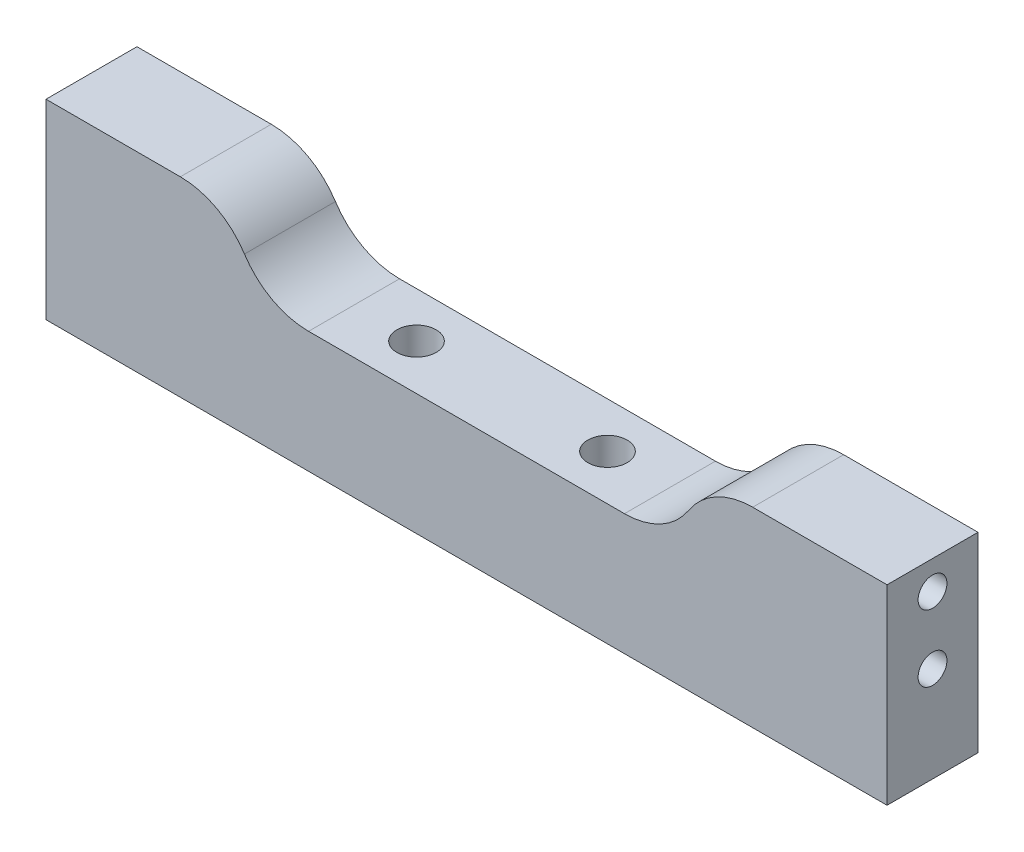
ISO-10303-21;
HEADER;
FILE_DESCRIPTION(('STEP AP214'),'2;1');
FILE_NAME('part.step','',(''),(''),'','','');
FILE_SCHEMA(('AUTOMOTIVE_DESIGN { 1 0 10303 214 1 1 1 1 }'));
ENDSEC;
DATA;
#1=APPLICATION_CONTEXT('core data for automotive mechanical design processes');
#2=APPLICATION_PROTOCOL_DEFINITION('international standard','automotive_design',2000,#1);
#3=PRODUCT_CONTEXT('',#1,'mechanical');
#4=PRODUCT('Part','Part','',(#3));
#5=PRODUCT_RELATED_PRODUCT_CATEGORY('part','',(#4));
#6=PRODUCT_DEFINITION_FORMATION('','',#4);
#7=PRODUCT_DEFINITION_CONTEXT('part definition',#1,'design');
#8=PRODUCT_DEFINITION('design','',#6,#7);
#9=PRODUCT_DEFINITION_SHAPE('','',#8);
#10=(LENGTH_UNIT() NAMED_UNIT(*) SI_UNIT(.MILLI.,.METRE.));
#11=(NAMED_UNIT(*) PLANE_ANGLE_UNIT() SI_UNIT($,.RADIAN.));
#12=(NAMED_UNIT(*) SI_UNIT($,.STERADIAN.) SOLID_ANGLE_UNIT());
#13=UNCERTAINTY_MEASURE_WITH_UNIT(LENGTH_MEASURE(1.E-05),#10,'distance_accuracy_value','');
#14=(GEOMETRIC_REPRESENTATION_CONTEXT(3) GLOBAL_UNCERTAINTY_ASSIGNED_CONTEXT((#13)) GLOBAL_UNIT_ASSIGNED_CONTEXT((#10,
#11,#12)) REPRESENTATION_CONTEXT('',''));
#15=CARTESIAN_POINT('',(0.,0.,0.));
#16=DIRECTION('',(0.,0.,1.));
#17=DIRECTION('',(1.,0.,0.));
#18=AXIS2_PLACEMENT_3D('',#15,#16,#17);
#19=CARTESIAN_POINT('',(-22.02,5.,4.7625));
#20=DIRECTION('',(0.,-1.,0.));
#21=DIRECTION('',(0.,0.,-1.));
#22=AXIS2_PLACEMENT_3D('',#19,#20,#21);
#23=PLANE('',#22);
#24=DIRECTION('',(-1.,0.,0.));
#25=VECTOR('',#24,1.);
#26=CARTESIAN_POINT('',(-22.02,5.,4.7625));
#27=LINE('',#26,#25);
#28=CARTESIAN_POINT('',(-14.9846580781794,5.,4.7625));
#29=VERTEX_POINT('',#28);
#30=CARTESIAN_POINT('',(-22.02,5.,4.7625));
#31=VERTEX_POINT('',#30);
#32=EDGE_CURVE('E168',#29,#31,#27,.T.);
#33=ORIENTED_EDGE('',*,*,#32,.F.);
#34=DIRECTION('',(0.,0.,1.));
#35=VECTOR('',#34,1.);
#36=CARTESIAN_POINT('',(-14.9846580781794,5.,4.7625));
#37=LINE('',#36,#35);
#38=CARTESIAN_POINT('',(-14.9846580781794,5.,0.));
#39=VERTEX_POINT('',#38);
#40=EDGE_CURVE('E215',#29,#39,#37,.F.);
#41=ORIENTED_EDGE('',*,*,#40,.T.);
#42=DIRECTION('',(-1.,0.,0.));
#43=VECTOR('',#42,1.);
#44=CARTESIAN_POINT('',(-22.02,5.,0.));
#45=LINE('',#44,#43);
#46=CARTESIAN_POINT('',(-22.02,5.,0.));
#47=VERTEX_POINT('',#46);
#48=EDGE_CURVE('E180',#39,#47,#45,.T.);
#49=ORIENTED_EDGE('',*,*,#48,.T.);
#50=DIRECTION('',(0.,0.,-1.));
#51=VECTOR('',#50,1.);
#52=CARTESIAN_POINT('',(-22.02,5.,4.7625));
#53=LINE('',#52,#51);
#54=EDGE_CURVE('E192',#31,#47,#53,.T.);
#55=ORIENTED_EDGE('',*,*,#54,.F.);
#56=EDGE_LOOP('',(#33,#41,#49,#55));
#57=FACE_BOUND('',#56,.T.);
#58=ADVANCED_FACE('F37',(#57),#23,.F.);
#59=CARTESIAN_POINT('',(22.02,-5.,4.7625));
#60=DIRECTION('',(-1.,0.,0.));
#61=DIRECTION('',(0.,0.,1.));
#62=AXIS2_PLACEMENT_3D('',#59,#60,#61);
#63=PLANE('',#62);
#64=CARTESIAN_POINT('',(22.02,3.5,2.38125));
#65=DIRECTION('',(1.,0.,0.));
#66=DIRECTION('',(0.,0.,-1.));
#67=AXIS2_PLACEMENT_3D('',#64,#65,#66);
#68=CIRCLE('',#67,0.755649999999999);
#69=CARTESIAN_POINT('',(22.02,3.5,1.6256));
#70=VERTEX_POINT('',#69);
#71=EDGE_CURVE('E134',#70,#70,#68,.T.);
#72=ORIENTED_EDGE('',*,*,#71,.F.);
#73=EDGE_LOOP('',(#72));
#74=FACE_BOUND('',#73,.T.);
#75=CARTESIAN_POINT('',(22.02,0.,2.38125));
#76=DIRECTION('',(1.,0.,0.));
#77=DIRECTION('',(0.,0.,-1.));
#78=AXIS2_PLACEMENT_3D('',#75,#76,#77);
#79=CIRCLE('',#78,0.755649999999999);
#80=CARTESIAN_POINT('',(22.02,0.,1.6256));
#81=VERTEX_POINT('',#80);
#82=EDGE_CURVE('E133',#81,#81,#79,.T.);
#83=ORIENTED_EDGE('',*,*,#82,.F.);
#84=EDGE_LOOP('',(#83));
#85=FACE_BOUND('',#84,.T.);
#86=DIRECTION('',(0.,1.,0.));
#87=VECTOR('',#86,1.);
#88=CARTESIAN_POINT('',(22.02,-5.,0.));
#89=LINE('',#88,#87);
#90=CARTESIAN_POINT('',(22.02,-5.,0.));
#91=VERTEX_POINT('',#90);
#92=CARTESIAN_POINT('',(22.02,5.,0.));
#93=VERTEX_POINT('',#92);
#94=EDGE_CURVE('E164',#91,#93,#89,.T.);
#95=ORIENTED_EDGE('',*,*,#94,.T.);
#96=DIRECTION('',(0.,0.,-1.));
#97=VECTOR('',#96,1.);
#98=CARTESIAN_POINT('',(22.02,5.,4.7625));
#99=LINE('',#98,#97);
#100=CARTESIAN_POINT('',(22.02,5.,4.7625));
#101=VERTEX_POINT('',#100);
#102=EDGE_CURVE('E195',#101,#93,#99,.T.);
#103=ORIENTED_EDGE('',*,*,#102,.F.);
#104=DIRECTION('',(0.,1.,0.));
#105=VECTOR('',#104,1.);
#106=CARTESIAN_POINT('',(22.02,-5.,4.7625));
#107=LINE('',#106,#105);
#108=CARTESIAN_POINT('',(22.02,-5.,4.7625));
#109=VERTEX_POINT('',#108);
#110=EDGE_CURVE('E165',#109,#101,#107,.T.);
#111=ORIENTED_EDGE('',*,*,#110,.F.);
#112=DIRECTION('',(0.,0.,-1.));
#113=VECTOR('',#112,1.);
#114=CARTESIAN_POINT('',(22.02,-5.,4.7625));
#115=LINE('',#114,#113);
#116=EDGE_CURVE('E177',#109,#91,#115,.T.);
#117=ORIENTED_EDGE('',*,*,#116,.T.);
#118=EDGE_LOOP('',(#95,#103,#111,#117));
#119=FACE_BOUND('',#118,.T.);
#120=ADVANCED_FACE('F273',(#74,#85,#119),#63,.F.);
#121=CARTESIAN_POINT('',(14.9846580781794,5.,0.));
#122=VERTEX_POINT('',#121);
#123=EDGE_CURVE('E181',#93,#122,#45,.T.);
#124=ORIENTED_EDGE('',*,*,#123,.T.);
#125=DIRECTION('',(0.,0.,-1.));
#126=VECTOR('',#125,1.);
#127=CARTESIAN_POINT('',(14.9846580781794,5.,4.7625));
#128=LINE('',#127,#126);
#129=CARTESIAN_POINT('',(14.9846580781794,5.,4.7625));
#130=VERTEX_POINT('',#129);
#131=EDGE_CURVE('E198',#122,#130,#128,.F.);
#132=ORIENTED_EDGE('',*,*,#131,.T.);
#133=EDGE_CURVE('E170',#101,#130,#27,.T.);
#134=ORIENTED_EDGE('',*,*,#133,.F.);
#135=ORIENTED_EDGE('',*,*,#102,.T.);
#136=EDGE_LOOP('',(#124,#132,#134,#135));
#137=FACE_BOUND('',#136,.T.);
#138=ADVANCED_FACE('F275',(#137),#23,.F.);
#139=CARTESIAN_POINT('',(-22.02,-5.,4.7625));
#140=DIRECTION('',(1.,0.,0.));
#141=DIRECTION('',(0.,0.,-1.));
#142=AXIS2_PLACEMENT_3D('',#139,#140,#141);
#143=PLANE('',#142);
#144=CARTESIAN_POINT('',(-22.02,3.5,2.38125));
#145=DIRECTION('',(-1.,0.,0.));
#146=DIRECTION('',(0.,0.,1.));
#147=AXIS2_PLACEMENT_3D('',#144,#145,#146);
#148=CIRCLE('',#147,0.755649999999999);
#149=CARTESIAN_POINT('',(-22.02,3.5,3.1369));
#150=VERTEX_POINT('',#149);
#151=EDGE_CURVE('E146',#150,#150,#148,.T.);
#152=ORIENTED_EDGE('',*,*,#151,.F.);
#153=EDGE_LOOP('',(#152));
#154=FACE_BOUND('',#153,.T.);
#155=CARTESIAN_POINT('',(-22.02,0.,2.38125));
#156=DIRECTION('',(-1.,0.,0.));
#157=DIRECTION('',(0.,0.,1.));
#158=AXIS2_PLACEMENT_3D('',#155,#156,#157);
#159=CIRCLE('',#158,0.755649999999999);
#160=CARTESIAN_POINT('',(-22.02,0.,3.1369));
#161=VERTEX_POINT('',#160);
#162=EDGE_CURVE('E152',#161,#161,#159,.T.);
#163=ORIENTED_EDGE('',*,*,#162,.F.);
#164=EDGE_LOOP('',(#163));
#165=FACE_BOUND('',#164,.T.);
#166=DIRECTION('',(0.,-1.,0.));
#167=VECTOR('',#166,1.);
#168=CARTESIAN_POINT('',(-22.02,-5.,0.));
#169=LINE('',#168,#167);
#170=CARTESIAN_POINT('',(-22.02,-5.,0.));
#171=VERTEX_POINT('',#170);
#172=EDGE_CURVE('E184',#47,#171,#169,.T.);
#173=ORIENTED_EDGE('',*,*,#172,.T.);
#174=DIRECTION('',(0.,0.,-1.));
#175=VECTOR('',#174,1.);
#176=CARTESIAN_POINT('',(-22.02,-5.,4.7625));
#177=LINE('',#176,#175);
#178=CARTESIAN_POINT('',(-22.02,-5.,4.7625));
#179=VERTEX_POINT('',#178);
#180=EDGE_CURVE('E189',#179,#171,#177,.T.);
#181=ORIENTED_EDGE('',*,*,#180,.F.);
#182=DIRECTION('',(0.,-1.,0.));
#183=VECTOR('',#182,1.);
#184=CARTESIAN_POINT('',(-22.02,-5.,4.7625));
#185=LINE('',#184,#183);
#186=EDGE_CURVE('E173',#31,#179,#185,.T.);
#187=ORIENTED_EDGE('',*,*,#186,.F.);
#188=ORIENTED_EDGE('',*,*,#54,.T.);
#189=EDGE_LOOP('',(#173,#181,#187,#188));
#190=FACE_BOUND('',#189,.T.);
#191=ADVANCED_FACE('F265',(#154,#165,#190),#143,.F.);
#192=CARTESIAN_POINT('',(-22.02,-5.,4.7625));
#193=DIRECTION('',(0.,1.,0.));
#194=DIRECTION('',(0.,0.,1.));
#195=AXIS2_PLACEMENT_3D('',#192,#193,#194);
#196=PLANE('',#195);
#197=CARTESIAN_POINT('',(5.,-5.,2.38125));
#198=DIRECTION('',(0.,1.,0.));
#199=DIRECTION('',(0.,0.,1.));
#200=AXIS2_PLACEMENT_3D('',#197,#198,#199);
#201=CIRCLE('',#200,1.03);
#202=CARTESIAN_POINT('',(5.,-5.,3.41125));
#203=VERTEX_POINT('',#202);
#204=EDGE_CURVE('E158',#203,#203,#201,.T.);
#205=ORIENTED_EDGE('',*,*,#204,.T.);
#206=EDGE_LOOP('',(#205));
#207=FACE_BOUND('',#206,.T.);
#208=CARTESIAN_POINT('',(-5.,-5.,2.38125));
#209=DIRECTION('',(0.,1.,0.));
#210=DIRECTION('',(0.,0.,1.));
#211=AXIS2_PLACEMENT_3D('',#208,#209,#210);
#212=CIRCLE('',#211,1.03);
#213=CARTESIAN_POINT('',(-5.,-5.,3.41125));
#214=VERTEX_POINT('',#213);
#215=EDGE_CURVE('E161',#214,#214,#212,.T.);
#216=ORIENTED_EDGE('',*,*,#215,.T.);
#217=EDGE_LOOP('',(#216));
#218=FACE_BOUND('',#217,.T.);
#219=DIRECTION('',(1.,0.,0.));
#220=VECTOR('',#219,1.);
#221=CARTESIAN_POINT('',(-22.02,-5.,0.));
#222=LINE('',#221,#220);
#223=EDGE_CURVE('E169',#171,#91,#222,.T.);
#224=ORIENTED_EDGE('',*,*,#223,.T.);
#225=ORIENTED_EDGE('',*,*,#116,.F.);
#226=DIRECTION('',(1.,0.,0.));
#227=VECTOR('',#226,1.);
#228=CARTESIAN_POINT('',(-22.02,-5.,4.7625));
#229=LINE('',#228,#227);
#230=EDGE_CURVE('E175',#179,#109,#229,.T.);
#231=ORIENTED_EDGE('',*,*,#230,.F.);
#232=ORIENTED_EDGE('',*,*,#180,.T.);
#233=EDGE_LOOP('',(#224,#225,#231,#232));
#234=FACE_BOUND('',#233,.T.);
#235=ADVANCED_FACE('F268',(#207,#218,#234),#196,.F.);
#236=CARTESIAN_POINT('',(0.,0.,4.7625));
#237=DIRECTION('',(0.,0.,-1.));
#238=DIRECTION('',(-1.,0.,0.));
#239=AXIS2_PLACEMENT_3D('',#236,#237,#238);
#240=PLANE('',#239);
#241=ORIENTED_EDGE('',*,*,#133,.T.);
#242=CARTESIAN_POINT('',(14.9846580781794,1.,4.7625));
#243=DIRECTION('',(0.,0.,-1.));
#244=DIRECTION('',(-1.,0.,0.));
#245=AXIS2_PLACEMENT_3D('',#242,#243,#244);
#246=CIRCLE('',#245,4.);
#247=CARTESIAN_POINT('',(11.6276690999431,3.175,4.7625));
#248=VERTEX_POINT('',#247);
#249=EDGE_CURVE('E208',#130,#248,#246,.F.);
#250=ORIENTED_EDGE('',*,*,#249,.T.);
#251=CARTESIAN_POINT('',(8.27068012170676,5.35,4.7625));
#252=DIRECTION('',(0.,0.,-1.));
#253=DIRECTION('',(-1.,0.,0.));
#254=AXIS2_PLACEMENT_3D('',#251,#252,#253);
#255=CIRCLE('',#254,4.);
#256=CARTESIAN_POINT('',(8.27068012170676,1.35,4.7625));
#257=VERTEX_POINT('',#256);
#258=EDGE_CURVE('E226',#248,#257,#255,.T.);
#259=ORIENTED_EDGE('',*,*,#258,.T.);
#260=DIRECTION('',(1.,0.,0.));
#261=VECTOR('',#260,1.);
#262=CARTESIAN_POINT('',(-11.,1.35,4.7625));
#263=LINE('',#262,#261);
#264=CARTESIAN_POINT('',(-8.27068012170676,1.35,4.7625));
#265=VERTEX_POINT('',#264);
#266=EDGE_CURVE('E203',#265,#257,#263,.T.);
#267=ORIENTED_EDGE('',*,*,#266,.F.);
#268=CARTESIAN_POINT('',(-8.27068012170676,5.35,4.7625));
#269=DIRECTION('',(0.,0.,-1.));
#270=DIRECTION('',(-1.,0.,0.));
#271=AXIS2_PLACEMENT_3D('',#268,#269,#270);
#272=CIRCLE('',#271,4.);
#273=CARTESIAN_POINT('',(-11.6276690999431,3.175,4.7625));
#274=VERTEX_POINT('',#273);
#275=EDGE_CURVE('E45',#265,#274,#272,.T.);
#276=ORIENTED_EDGE('',*,*,#275,.T.);
#277=CARTESIAN_POINT('',(-14.9846580781794,1.,4.7625));
#278=DIRECTION('',(0.,0.,-1.));
#279=DIRECTION('',(-1.,0.,0.));
#280=AXIS2_PLACEMENT_3D('',#277,#278,#279);
#281=CIRCLE('',#280,4.);
#282=EDGE_CURVE('E206',#274,#29,#281,.F.);
#283=ORIENTED_EDGE('',*,*,#282,.T.);
#284=ORIENTED_EDGE('',*,*,#32,.T.);
#285=ORIENTED_EDGE('',*,*,#186,.T.);
#286=ORIENTED_EDGE('',*,*,#230,.T.);
#287=ORIENTED_EDGE('',*,*,#110,.T.);
#288=EDGE_LOOP('',(#241,#250,#259,#267,#276,#283,#284,#285,#286,#287));
#289=FACE_BOUND('',#288,.T.);
#290=ADVANCED_FACE('F243',(#289),#240,.F.);
#291=CARTESIAN_POINT('',(0.,0.,0.));
#292=DIRECTION('',(0.,0.,-1.));
#293=DIRECTION('',(-1.,0.,0.));
#294=AXIS2_PLACEMENT_3D('',#291,#292,#293);
#295=PLANE('',#294);
#296=DIRECTION('',(-1.,0.,0.));
#297=VECTOR('',#296,1.);
#298=CARTESIAN_POINT('',(0.,1.35,0.));
#299=LINE('',#298,#297);
#300=CARTESIAN_POINT('',(8.27068012170676,1.35,0.));
#301=VERTEX_POINT('',#300);
#302=CARTESIAN_POINT('',(-8.27068012170676,1.35,0.));
#303=VERTEX_POINT('',#302);
#304=EDGE_CURVE('E140',#301,#303,#299,.T.);
#305=ORIENTED_EDGE('',*,*,#304,.F.);
#306=CARTESIAN_POINT('',(8.27068012170676,5.35,0.));
#307=DIRECTION('',(0.,0.,-1.));
#308=DIRECTION('',(-1.,0.,0.));
#309=AXIS2_PLACEMENT_3D('',#306,#307,#308);
#310=CIRCLE('',#309,4.);
#311=CARTESIAN_POINT('',(11.6276690999431,3.175,0.));
#312=VERTEX_POINT('',#311);
#313=EDGE_CURVE('E228',#301,#312,#310,.F.);
#314=ORIENTED_EDGE('',*,*,#313,.T.);
#315=CARTESIAN_POINT('',(14.9846580781794,1.,0.));
#316=DIRECTION('',(0.,0.,-1.));
#317=DIRECTION('',(-1.,0.,0.));
#318=AXIS2_PLACEMENT_3D('',#315,#316,#317);
#319=CIRCLE('',#318,4.);
#320=EDGE_CURVE('E213',#312,#122,#319,.T.);
#321=ORIENTED_EDGE('',*,*,#320,.T.);
#322=ORIENTED_EDGE('',*,*,#123,.F.);
#323=ORIENTED_EDGE('',*,*,#94,.F.);
#324=ORIENTED_EDGE('',*,*,#223,.F.);
#325=ORIENTED_EDGE('',*,*,#172,.F.);
#326=ORIENTED_EDGE('',*,*,#48,.F.);
#327=CARTESIAN_POINT('',(-14.9846580781794,1.,0.));
#328=DIRECTION('',(0.,0.,-1.));
#329=DIRECTION('',(-1.,0.,0.));
#330=AXIS2_PLACEMENT_3D('',#327,#328,#329);
#331=CIRCLE('',#330,4.);
#332=CARTESIAN_POINT('',(-11.6276690999431,3.175,0.));
#333=VERTEX_POINT('',#332);
#334=EDGE_CURVE('E211',#39,#333,#331,.T.);
#335=ORIENTED_EDGE('',*,*,#334,.T.);
#336=CARTESIAN_POINT('',(-8.27068012170676,5.35,0.));
#337=DIRECTION('',(0.,0.,-1.));
#338=DIRECTION('',(-1.,0.,0.));
#339=AXIS2_PLACEMENT_3D('',#336,#337,#338);
#340=CIRCLE('',#339,4.);
#341=EDGE_CURVE('E11',#333,#303,#340,.F.);
#342=ORIENTED_EDGE('',*,*,#341,.T.);
#343=EDGE_LOOP('',(#305,#314,#321,#322,#323,#324,#325,#326,#335,#342));
#344=FACE_BOUND('',#343,.T.);
#345=ADVANCED_FACE('F233',(#344),#295,.T.);
#346=CARTESIAN_POINT('',(-5.,-5.,2.38125));
#347=DIRECTION('',(0.,1.,0.));
#348=DIRECTION('',(0.,0.,1.));
#349=AXIS2_PLACEMENT_3D('',#346,#347,#348);
#350=CYLINDRICAL_SURFACE('',#349,1.03);
#351=CARTESIAN_POINT('',(-5.,1.35,2.38125));
#352=DIRECTION('',(0.,-1.,0.));
#353=DIRECTION('',(0.,0.,-1.));
#354=AXIS2_PLACEMENT_3D('',#351,#352,#353);
#355=CIRCLE('',#354,1.03);
#356=CARTESIAN_POINT('',(-5.,1.35,1.35125));
#357=VERTEX_POINT('',#356);
#358=EDGE_CURVE('E202',#357,#357,#355,.F.);
#359=ORIENTED_EDGE('',*,*,#358,.T.);
#360=EDGE_LOOP('',(#359));
#361=FACE_BOUND('',#360,.T.);
#362=ORIENTED_EDGE('',*,*,#215,.F.);
#363=EDGE_LOOP('',(#362));
#364=FACE_BOUND('',#363,.T.);
#365=ADVANCED_FACE('F345',(#361,#364),#350,.F.);
#366=CARTESIAN_POINT('',(5.,-5.,2.38125));
#367=DIRECTION('',(0.,1.,0.));
#368=DIRECTION('',(0.,0.,1.));
#369=AXIS2_PLACEMENT_3D('',#366,#367,#368);
#370=CYLINDRICAL_SURFACE('',#369,1.03);
#371=CARTESIAN_POINT('',(5.,1.35,2.38125));
#372=DIRECTION('',(0.,-1.,0.));
#373=DIRECTION('',(0.,0.,-1.));
#374=AXIS2_PLACEMENT_3D('',#371,#372,#373);
#375=CIRCLE('',#374,1.03);
#376=CARTESIAN_POINT('',(5.,1.35,1.35125));
#377=VERTEX_POINT('',#376);
#378=EDGE_CURVE('E199',#377,#377,#375,.F.);
#379=ORIENTED_EDGE('',*,*,#378,.T.);
#380=EDGE_LOOP('',(#379));
#381=FACE_BOUND('',#380,.T.);
#382=ORIENTED_EDGE('',*,*,#204,.F.);
#383=EDGE_LOOP('',(#382));
#384=FACE_BOUND('',#383,.T.);
#385=ADVANCED_FACE('F349',(#381,#384),#370,.F.);
#386=CARTESIAN_POINT('',(-15.67,0.,2.38125));
#387=DIRECTION('',(-1.,0.,0.));
#388=DIRECTION('',(0.,0.,1.));
#389=AXIS2_PLACEMENT_3D('',#386,#387,#388);
#390=CONICAL_SURFACE('',#389,0.755649999999998,1.02974425867665);
#391=CARTESIAN_POINT('',(-15.2159596732318,0.,2.38125));
#392=VERTEX_POINT('',#391);
#393=VERTEX_LOOP('',#392);
#394=FACE_BOUND('',#393,.T.);
#395=CARTESIAN_POINT('',(-15.67,0.,2.38125));
#396=DIRECTION('',(-1.,0.,0.));
#397=DIRECTION('',(0.,0.,1.));
#398=AXIS2_PLACEMENT_3D('',#395,#396,#397);
#399=CIRCLE('',#398,0.755649999999998);
#400=CARTESIAN_POINT('',(-15.67,0.,3.1369));
#401=VERTEX_POINT('',#400);
#402=EDGE_CURVE('E155',#401,#401,#399,.T.);
#403=ORIENTED_EDGE('',*,*,#402,.T.);
#404=EDGE_LOOP('',(#403));
#405=FACE_BOUND('',#404,.T.);
#406=ADVANCED_FACE('F360',(#394,#405),#390,.F.);
#407=CARTESIAN_POINT('',(-22.02,0.,2.38125));
#408=DIRECTION('',(-1.,0.,0.));
#409=DIRECTION('',(0.,0.,1.));
#410=AXIS2_PLACEMENT_3D('',#407,#408,#409);
#411=CYLINDRICAL_SURFACE('',#410,0.755649999999999);
#412=ORIENTED_EDGE('',*,*,#402,.F.);
#413=EDGE_LOOP('',(#412));
#414=FACE_BOUND('',#413,.T.);
#415=ORIENTED_EDGE('',*,*,#162,.T.);
#416=EDGE_LOOP('',(#415));
#417=FACE_BOUND('',#416,.T.);
#418=ADVANCED_FACE('F371',(#414,#417),#411,.F.);
#419=CARTESIAN_POINT('',(-15.67,3.5,2.38125));
#420=DIRECTION('',(-1.,0.,0.));
#421=DIRECTION('',(0.,0.,1.));
#422=AXIS2_PLACEMENT_3D('',#419,#420,#421);
#423=CONICAL_SURFACE('',#422,0.755649999999998,1.02974425867665);
#424=CARTESIAN_POINT('',(-15.2159596732318,3.5,2.38125));
#425=VERTEX_POINT('',#424);
#426=VERTEX_LOOP('',#425);
#427=FACE_BOUND('',#426,.T.);
#428=CARTESIAN_POINT('',(-15.67,3.5,2.38125));
#429=DIRECTION('',(-1.,0.,0.));
#430=DIRECTION('',(0.,0.,1.));
#431=AXIS2_PLACEMENT_3D('',#428,#429,#430);
#432=CIRCLE('',#431,0.755649999999998);
#433=CARTESIAN_POINT('',(-15.67,3.5,3.1369));
#434=VERTEX_POINT('',#433);
#435=EDGE_CURVE('E149',#434,#434,#432,.T.);
#436=ORIENTED_EDGE('',*,*,#435,.T.);
#437=EDGE_LOOP('',(#436));
#438=FACE_BOUND('',#437,.T.);
#439=ADVANCED_FACE('F380',(#427,#438),#423,.F.);
#440=CARTESIAN_POINT('',(-22.02,3.5,2.38125));
#441=DIRECTION('',(-1.,0.,0.));
#442=DIRECTION('',(0.,0.,1.));
#443=AXIS2_PLACEMENT_3D('',#440,#441,#442);
#444=CYLINDRICAL_SURFACE('',#443,0.755649999999998);
#445=ORIENTED_EDGE('',*,*,#435,.F.);
#446=EDGE_LOOP('',(#445));
#447=FACE_BOUND('',#446,.T.);
#448=ORIENTED_EDGE('',*,*,#151,.T.);
#449=EDGE_LOOP('',(#448));
#450=FACE_BOUND('',#449,.T.);
#451=ADVANCED_FACE('F301',(#447,#450),#444,.F.);
#452=CARTESIAN_POINT('',(15.67,0.,2.38125));
#453=DIRECTION('',(1.,0.,0.));
#454=DIRECTION('',(0.,0.,-1.));
#455=AXIS2_PLACEMENT_3D('',#452,#453,#454);
#456=CONICAL_SURFACE('',#455,0.755649999999998,1.02974425867665);
#457=CARTESIAN_POINT('',(15.2159596732318,0.,2.38125));
#458=VERTEX_POINT('',#457);
#459=VERTEX_LOOP('',#458);
#460=FACE_BOUND('',#459,.T.);
#461=CARTESIAN_POINT('',(15.67,0.,2.38125));
#462=DIRECTION('',(1.,0.,0.));
#463=DIRECTION('',(0.,0.,-1.));
#464=AXIS2_PLACEMENT_3D('',#461,#462,#463);
#465=CIRCLE('',#464,0.755649999999998);
#466=CARTESIAN_POINT('',(15.67,0.,1.6256));
#467=VERTEX_POINT('',#466);
#468=EDGE_CURVE('E137',#467,#467,#465,.T.);
#469=ORIENTED_EDGE('',*,*,#468,.T.);
#470=EDGE_LOOP('',(#469));
#471=FACE_BOUND('',#470,.T.);
#472=ADVANCED_FACE('F306',(#460,#471),#456,.F.);
#473=CARTESIAN_POINT('',(22.02,0.,2.38125));
#474=DIRECTION('',(1.,0.,0.));
#475=DIRECTION('',(0.,0.,-1.));
#476=AXIS2_PLACEMENT_3D('',#473,#474,#475);
#477=CYLINDRICAL_SURFACE('',#476,0.755649999999999);
#478=ORIENTED_EDGE('',*,*,#468,.F.);
#479=EDGE_LOOP('',(#478));
#480=FACE_BOUND('',#479,.T.);
#481=ORIENTED_EDGE('',*,*,#82,.T.);
#482=EDGE_LOOP('',(#481));
#483=FACE_BOUND('',#482,.T.);
#484=ADVANCED_FACE('F127',(#480,#483),#477,.F.);
#485=CARTESIAN_POINT('',(15.67,3.5,2.38125));
#486=DIRECTION('',(1.,0.,0.));
#487=DIRECTION('',(0.,0.,-1.));
#488=AXIS2_PLACEMENT_3D('',#485,#486,#487);
#489=CONICAL_SURFACE('',#488,0.755649999999998,1.02974425867665);
#490=CARTESIAN_POINT('',(15.2159596732318,3.5,2.38125));
#491=VERTEX_POINT('',#490);
#492=VERTEX_LOOP('',#491);
#493=FACE_BOUND('',#492,.T.);
#494=CARTESIAN_POINT('',(15.67,3.5,2.38125));
#495=DIRECTION('',(1.,0.,0.));
#496=DIRECTION('',(0.,0.,-1.));
#497=AXIS2_PLACEMENT_3D('',#494,#495,#496);
#498=CIRCLE('',#497,0.755649999999998);
#499=CARTESIAN_POINT('',(15.67,3.5,1.6256));
#500=VERTEX_POINT('',#499);
#501=EDGE_CURVE('E131',#500,#500,#498,.T.);
#502=ORIENTED_EDGE('',*,*,#501,.T.);
#503=EDGE_LOOP('',(#502));
#504=FACE_BOUND('',#503,.T.);
#505=ADVANCED_FACE('F123',(#493,#504),#489,.F.);
#506=CARTESIAN_POINT('',(22.02,3.5,2.38125));
#507=DIRECTION('',(1.,0.,0.));
#508=DIRECTION('',(0.,0.,-1.));
#509=AXIS2_PLACEMENT_3D('',#506,#507,#508);
#510=CYLINDRICAL_SURFACE('',#509,0.755649999999999);
#511=ORIENTED_EDGE('',*,*,#501,.F.);
#512=EDGE_LOOP('',(#511));
#513=FACE_BOUND('',#512,.T.);
#514=ORIENTED_EDGE('',*,*,#71,.T.);
#515=EDGE_LOOP('',(#514));
#516=FACE_BOUND('',#515,.T.);
#517=ADVANCED_FACE('F126',(#513,#516),#510,.F.);
#518=CARTESIAN_POINT('',(-11.,1.35,-5.2375));
#519=DIRECTION('',(0.,-1.,0.));
#520=DIRECTION('',(0.,0.,-1.));
#521=AXIS2_PLACEMENT_3D('',#518,#519,#520);
#522=PLANE('',#521);
#523=ORIENTED_EDGE('',*,*,#266,.T.);
#524=DIRECTION('',(0.,0.,-1.));
#525=VECTOR('',#524,1.);
#526=CARTESIAN_POINT('',(8.27068012170676,1.35,-5.2375));
#527=LINE('',#526,#525);
#528=EDGE_CURVE('E223',#257,#301,#527,.T.);
#529=ORIENTED_EDGE('',*,*,#528,.T.);
#530=ORIENTED_EDGE('',*,*,#304,.T.);
#531=DIRECTION('',(0.,0.,1.));
#532=VECTOR('',#531,1.);
#533=CARTESIAN_POINT('',(-8.27068012170676,1.35,-5.2375));
#534=LINE('',#533,#532);
#535=EDGE_CURVE('E220',#303,#265,#534,.T.);
#536=ORIENTED_EDGE('',*,*,#535,.T.);
#537=EDGE_LOOP('',(#523,#529,#530,#536));
#538=FACE_BOUND('',#537,.T.);
#539=ORIENTED_EDGE('',*,*,#378,.F.);
#540=EDGE_LOOP('',(#539));
#541=FACE_BOUND('',#540,.T.);
#542=ORIENTED_EDGE('',*,*,#358,.F.);
#543=EDGE_LOOP('',(#542));
#544=FACE_BOUND('',#543,.T.);
#545=ADVANCED_FACE('F245',(#538,#541,#544),#522,.F.);
#546=CARTESIAN_POINT('',(14.9846580781794,1.,-5.2375));
#547=DIRECTION('',(0.,0.,-1.));
#548=DIRECTION('',(-1.,0.,0.));
#549=AXIS2_PLACEMENT_3D('',#546,#547,#548);
#550=CYLINDRICAL_SURFACE('',#549,4.);
#551=ORIENTED_EDGE('',*,*,#320,.F.);
#552=DIRECTION('',(0.,0.,-1.));
#553=VECTOR('',#552,1.);
#554=CARTESIAN_POINT('',(11.6276690999431,3.175,-5.2375));
#555=LINE('',#554,#553);
#556=EDGE_CURVE('E217',#312,#248,#555,.F.);
#557=ORIENTED_EDGE('',*,*,#556,.T.);
#558=ORIENTED_EDGE('',*,*,#249,.F.);
#559=ORIENTED_EDGE('',*,*,#131,.F.);
#560=EDGE_LOOP('',(#551,#557,#558,#559));
#561=FACE_BOUND('',#560,.T.);
#562=ADVANCED_FACE('F240',(#561),#550,.T.);
#563=CARTESIAN_POINT('',(-14.9846580781794,1.,-5.2375));
#564=DIRECTION('',(0.,0.,1.));
#565=DIRECTION('',(1.,0.,0.));
#566=AXIS2_PLACEMENT_3D('',#563,#564,#565);
#567=CYLINDRICAL_SURFACE('',#566,4.);
#568=ORIENTED_EDGE('',*,*,#282,.F.);
#569=DIRECTION('',(0.,0.,1.));
#570=VECTOR('',#569,1.);
#571=CARTESIAN_POINT('',(-11.6276690999431,3.175,-5.2375));
#572=LINE('',#571,#570);
#573=EDGE_CURVE('E58',#274,#333,#572,.F.);
#574=ORIENTED_EDGE('',*,*,#573,.T.);
#575=ORIENTED_EDGE('',*,*,#334,.F.);
#576=ORIENTED_EDGE('',*,*,#40,.F.);
#577=EDGE_LOOP('',(#568,#574,#575,#576));
#578=FACE_BOUND('',#577,.T.);
#579=ADVANCED_FACE('F256',(#578),#567,.T.);
#580=CARTESIAN_POINT('',(8.27068012170676,5.35,-5.2375));
#581=DIRECTION('',(0.,0.,-1.));
#582=DIRECTION('',(-1.,0.,0.));
#583=AXIS2_PLACEMENT_3D('',#580,#581,#582);
#584=CYLINDRICAL_SURFACE('',#583,4.);
#585=ORIENTED_EDGE('',*,*,#313,.F.);
#586=ORIENTED_EDGE('',*,*,#528,.F.);
#587=ORIENTED_EDGE('',*,*,#258,.F.);
#588=ORIENTED_EDGE('',*,*,#556,.F.);
#589=EDGE_LOOP('',(#585,#586,#587,#588));
#590=FACE_BOUND('',#589,.T.);
#591=ADVANCED_FACE('F241',(#590),#584,.F.);
#592=CARTESIAN_POINT('',(-8.27068012170676,5.35,-5.2375));
#593=DIRECTION('',(0.,0.,1.));
#594=DIRECTION('',(1.,0.,0.));
#595=AXIS2_PLACEMENT_3D('',#592,#593,#594);
#596=CYLINDRICAL_SURFACE('',#595,4.);
#597=ORIENTED_EDGE('',*,*,#341,.F.);
#598=ORIENTED_EDGE('',*,*,#573,.F.);
#599=ORIENTED_EDGE('',*,*,#275,.F.);
#600=ORIENTED_EDGE('',*,*,#535,.F.);
#601=EDGE_LOOP('',(#597,#598,#599,#600));
#602=FACE_BOUND('',#601,.T.);
#603=ADVANCED_FACE('F39',(#602),#596,.F.);
#604=CLOSED_SHELL('',(#58,#120,#138,#191,#235,#290,#345,#365,#385,#406,#418,#439,#451,#472,#484,
#505,#517,#545,#562,#579,#591,#603));
#605=MANIFOLD_SOLID_BREP('B2',#604);
#606=ADVANCED_BREP_SHAPE_REPRESENTATION('',(#18,#605),#14);
#607=SHAPE_DEFINITION_REPRESENTATION(#9,#606);
ENDSEC;
END-ISO-10303-21;
